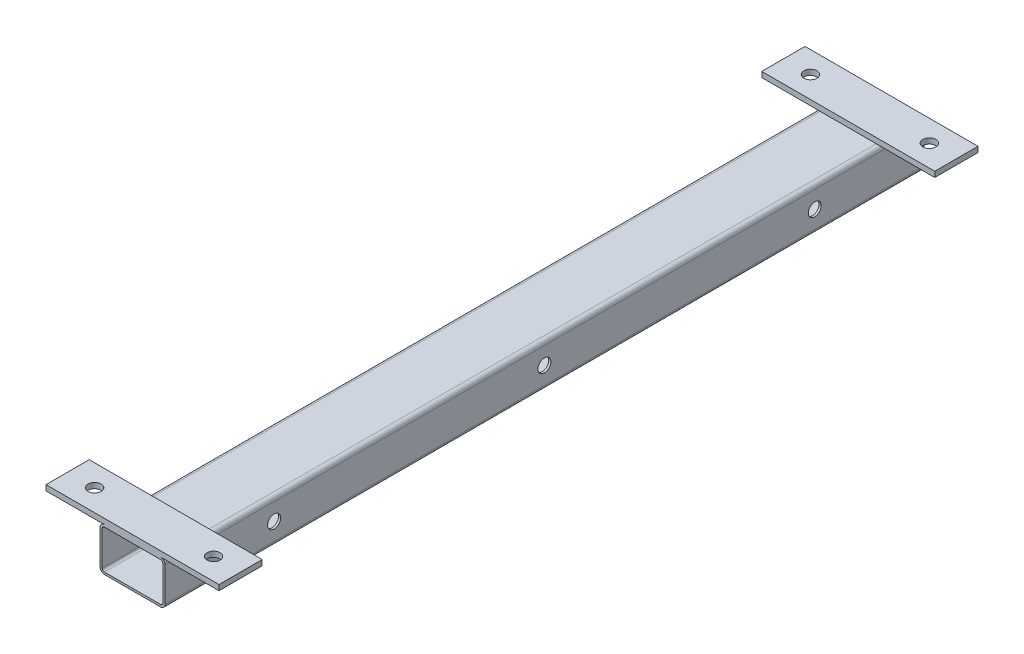
ISO-10303-21;
HEADER;
FILE_DESCRIPTION(('STEP AP214'),'2;1');
FILE_NAME('part.step','',(''),(''),'','','');
FILE_SCHEMA(('AUTOMOTIVE_DESIGN { 1 0 10303 214 1 1 1 1 }'));
ENDSEC;
DATA;
#1=APPLICATION_CONTEXT('core data for automotive mechanical design processes');
#2=APPLICATION_PROTOCOL_DEFINITION('international standard','automotive_design',2000,#1);
#3=PRODUCT_CONTEXT('',#1,'mechanical');
#4=PRODUCT('Part','Part','',(#3));
#5=PRODUCT_RELATED_PRODUCT_CATEGORY('part','',(#4));
#6=PRODUCT_DEFINITION_FORMATION('','',#4);
#7=PRODUCT_DEFINITION_CONTEXT('part definition',#1,'design');
#8=PRODUCT_DEFINITION('design','',#6,#7);
#9=PRODUCT_DEFINITION_SHAPE('','',#8);
#10=(LENGTH_UNIT() NAMED_UNIT(*) SI_UNIT(.MILLI.,.METRE.));
#11=(NAMED_UNIT(*) PLANE_ANGLE_UNIT() SI_UNIT($,.RADIAN.));
#12=(NAMED_UNIT(*) SI_UNIT($,.STERADIAN.) SOLID_ANGLE_UNIT());
#13=UNCERTAINTY_MEASURE_WITH_UNIT(LENGTH_MEASURE(1.E-05),#10,'distance_accuracy_value','');
#14=(GEOMETRIC_REPRESENTATION_CONTEXT(3) GLOBAL_UNCERTAINTY_ASSIGNED_CONTEXT((#13)) GLOBAL_UNIT_ASSIGNED_CONTEXT((#10,
#11,#12)) REPRESENTATION_CONTEXT('',''));
#15=CARTESIAN_POINT('',(0.,0.,0.));
#16=DIRECTION('',(0.,0.,1.));
#17=DIRECTION('',(1.,0.,0.));
#18=AXIS2_PLACEMENT_3D('',#15,#16,#17);
#19=CARTESIAN_POINT('',(4.00000000000003,40.,702.));
#20=DIRECTION('',(0.,-1.,0.));
#21=DIRECTION('',(0.,0.,-1.));
#22=AXIS2_PLACEMENT_3D('',#19,#20,#21);
#23=PLANE('',#22);
#24=DIRECTION('',(0.,0.,-1.));
#25=VECTOR('',#24,1.);
#26=CARTESIAN_POINT('',(4.00000000000003,40.,702.));
#27=LINE('',#26,#25);
#28=CARTESIAN_POINT('',(4.00000000000003,40.,662.));
#29=VERTEX_POINT('',#28);
#30=CARTESIAN_POINT('',(4.,40.,40.));
#31=VERTEX_POINT('',#30);
#32=EDGE_CURVE('E413',#29,#31,#27,.T.);
#33=ORIENTED_EDGE('',*,*,#32,.F.);
#34=DIRECTION('',(1.,0.,0.));
#35=VECTOR('',#34,1.);
#36=CARTESIAN_POINT('',(-50.,40.,662.));
#37=LINE('',#36,#35);
#38=CARTESIAN_POINT('',(56.,40.,662.));
#39=VERTEX_POINT('',#38);
#40=EDGE_CURVE('E254',#29,#39,#37,.T.);
#41=ORIENTED_EDGE('',*,*,#40,.T.);
#42=DIRECTION('',(0.,0.,-1.));
#43=VECTOR('',#42,1.);
#44=CARTESIAN_POINT('',(56.,40.,702.));
#45=LINE('',#44,#43);
#46=CARTESIAN_POINT('',(56.,40.,40.));
#47=VERTEX_POINT('',#46);
#48=EDGE_CURVE('E412',#39,#47,#45,.T.);
#49=ORIENTED_EDGE('',*,*,#48,.T.);
#50=DIRECTION('',(1.,0.,0.));
#51=VECTOR('',#50,1.);
#52=CARTESIAN_POINT('',(-50.,40.,40.));
#53=LINE('',#52,#51);
#54=EDGE_CURVE('E293',#31,#47,#53,.T.);
#55=ORIENTED_EDGE('',*,*,#54,.F.);
#56=EDGE_LOOP('',(#33,#41,#49,#55));
#57=FACE_BOUND('',#56,.T.);
#58=ADVANCED_FACE('F37',(#57),#23,.F.);
#59=CARTESIAN_POINT('',(56.,4.,702.));
#60=DIRECTION('',(0.,0.,-1.));
#61=DIRECTION('',(-1.,0.,0.));
#62=AXIS2_PLACEMENT_3D('',#59,#60,#61);
#63=PLANE('',#62);
#64=CARTESIAN_POINT('',(56.,4.,702.));
#65=DIRECTION('',(0.,0.,1.));
#66=DIRECTION('',(-1.,0.,0.));
#67=AXIS2_PLACEMENT_3D('',#64,#65,#66);
#68=CIRCLE('',#67,4.);
#69=CARTESIAN_POINT('',(56.,0.,702.));
#70=VERTEX_POINT('',#69);
#71=CARTESIAN_POINT('',(60.,4.00000000000003,702.));
#72=VERTEX_POINT('',#71);
#73=EDGE_CURVE('E367',#70,#72,#68,.T.);
#74=ORIENTED_EDGE('',*,*,#73,.T.);
#75=DIRECTION('',(0.,1.,0.));
#76=VECTOR('',#75,1.);
#77=CARTESIAN_POINT('',(60.,36.,702.));
#78=LINE('',#77,#76);
#79=CARTESIAN_POINT('',(60.,36.,702.));
#80=VERTEX_POINT('',#79);
#81=EDGE_CURVE('E369',#72,#80,#78,.T.);
#82=ORIENTED_EDGE('',*,*,#81,.T.);
#83=CARTESIAN_POINT('',(56.,36.,702.));
#84=DIRECTION('',(0.,0.,1.));
#85=DIRECTION('',(1.,0.,0.));
#86=AXIS2_PLACEMENT_3D('',#83,#84,#85);
#87=CIRCLE('',#86,4.);
#88=CARTESIAN_POINT('',(56.,40.,702.));
#89=VERTEX_POINT('',#88);
#90=EDGE_CURVE('E372',#80,#89,#87,.T.);
#91=ORIENTED_EDGE('',*,*,#90,.T.);
#92=DIRECTION('',(-1.,0.,0.));
#93=VECTOR('',#92,1.);
#94=CARTESIAN_POINT('',(0.,40.,702.));
#95=LINE('',#94,#93);
#96=CARTESIAN_POINT('',(110.,40.,702.));
#97=VERTEX_POINT('',#96);
#98=EDGE_CURVE('E221',#97,#89,#95,.T.);
#99=ORIENTED_EDGE('',*,*,#98,.F.);
#100=DIRECTION('',(0.,-1.,0.));
#101=VECTOR('',#100,1.);
#102=CARTESIAN_POINT('',(110.,45.,702.));
#103=LINE('',#102,#101);
#104=CARTESIAN_POINT('',(110.,45.,702.));
#105=VERTEX_POINT('',#104);
#106=EDGE_CURVE('E212',#105,#97,#103,.T.);
#107=ORIENTED_EDGE('',*,*,#106,.F.);
#108=DIRECTION('',(-1.,0.,0.));
#109=VECTOR('',#108,1.);
#110=CARTESIAN_POINT('',(110.,45.,702.));
#111=LINE('',#110,#109);
#112=CARTESIAN_POINT('',(-50.,45.,702.));
#113=VERTEX_POINT('',#112);
#114=EDGE_CURVE('E218',#105,#113,#111,.T.);
#115=ORIENTED_EDGE('',*,*,#114,.T.);
#116=DIRECTION('',(0.,-1.,0.));
#117=VECTOR('',#116,1.);
#118=CARTESIAN_POINT('',(-50.,45.,702.));
#119=LINE('',#118,#117);
#120=CARTESIAN_POINT('',(-50.,40.,702.));
#121=VERTEX_POINT('',#120);
#122=EDGE_CURVE('E247',#113,#121,#119,.T.);
#123=ORIENTED_EDGE('',*,*,#122,.T.);
#124=CARTESIAN_POINT('',(4.,40.,702.));
#125=VERTEX_POINT('',#124);
#126=EDGE_CURVE('E256',#125,#121,#95,.T.);
#127=ORIENTED_EDGE('',*,*,#126,.F.);
#128=CARTESIAN_POINT('',(4.,36.,702.));
#129=DIRECTION('',(0.,0.,1.));
#130=DIRECTION('',(-1.,0.,0.));
#131=AXIS2_PLACEMENT_3D('',#128,#129,#130);
#132=CIRCLE('',#131,4.);
#133=CARTESIAN_POINT('',(0.,36.,702.));
#134=VERTEX_POINT('',#133);
#135=EDGE_CURVE('E374',#125,#134,#132,.T.);
#136=ORIENTED_EDGE('',*,*,#135,.T.);
#137=DIRECTION('',(0.,-1.,0.));
#138=VECTOR('',#137,1.);
#139=CARTESIAN_POINT('',(0.,4.00000000000003,702.));
#140=LINE('',#139,#138);
#141=CARTESIAN_POINT('',(0.,4.00000000000003,702.));
#142=VERTEX_POINT('',#141);
#143=EDGE_CURVE('E376',#134,#142,#140,.T.);
#144=ORIENTED_EDGE('',*,*,#143,.T.);
#145=CARTESIAN_POINT('',(4.,4.,702.));
#146=DIRECTION('',(0.,0.,1.));
#147=DIRECTION('',(1.,0.,0.));
#148=AXIS2_PLACEMENT_3D('',#145,#146,#147);
#149=CIRCLE('',#148,4.);
#150=CARTESIAN_POINT('',(4.00000000000003,0.,702.));
#151=VERTEX_POINT('',#150);
#152=EDGE_CURVE('E378',#142,#151,#149,.T.);
#153=ORIENTED_EDGE('',*,*,#152,.T.);
#154=DIRECTION('',(1.,0.,0.));
#155=VECTOR('',#154,1.);
#156=CARTESIAN_POINT('',(56.,0.,702.));
#157=LINE('',#156,#155);
#158=EDGE_CURVE('E380',#151,#70,#157,.T.);
#159=ORIENTED_EDGE('',*,*,#158,.T.);
#160=EDGE_LOOP('',(#74,#82,#91,#99,#107,#115,#123,#127,#136,#144,#153,#159));
#161=FACE_BOUND('',#160,.T.);
#162=CARTESIAN_POINT('',(4.,4.,702.));
#163=DIRECTION('',(0.,0.,1.));
#164=DIRECTION('',(1.,0.,0.));
#165=AXIS2_PLACEMENT_3D('',#162,#163,#164);
#166=CIRCLE('',#165,2.);
#167=CARTESIAN_POINT('',(2.,4.00000000000003,702.));
#168=VERTEX_POINT('',#167);
#169=CARTESIAN_POINT('',(4.00000000000003,2.,702.));
#170=VERTEX_POINT('',#169);
#171=EDGE_CURVE('E310',#168,#170,#166,.T.);
#172=ORIENTED_EDGE('',*,*,#171,.F.);
#173=DIRECTION('',(0.,-1.,0.));
#174=VECTOR('',#173,1.);
#175=CARTESIAN_POINT('',(2.,4.00000000000003,702.));
#176=LINE('',#175,#174);
#177=CARTESIAN_POINT('',(2.,36.,702.));
#178=VERTEX_POINT('',#177);
#179=EDGE_CURVE('E325',#178,#168,#176,.T.);
#180=ORIENTED_EDGE('',*,*,#179,.F.);
#181=CARTESIAN_POINT('',(4.,36.,702.));
#182=DIRECTION('',(0.,0.,1.));
#183=DIRECTION('',(-1.,0.,0.));
#184=AXIS2_PLACEMENT_3D('',#181,#182,#183);
#185=CIRCLE('',#184,2.);
#186=CARTESIAN_POINT('',(4.00000000000001,38.,702.));
#187=VERTEX_POINT('',#186);
#188=EDGE_CURVE('E323',#187,#178,#185,.T.);
#189=ORIENTED_EDGE('',*,*,#188,.F.);
#190=DIRECTION('',(-1.,0.,0.));
#191=VECTOR('',#190,1.);
#192=CARTESIAN_POINT('',(4.00000000000001,38.,702.));
#193=LINE('',#192,#191);
#194=CARTESIAN_POINT('',(56.,38.,702.));
#195=VERTEX_POINT('',#194);
#196=EDGE_CURVE('E321',#195,#187,#193,.T.);
#197=ORIENTED_EDGE('',*,*,#196,.F.);
#198=CARTESIAN_POINT('',(56.,36.,702.));
#199=DIRECTION('',(0.,0.,1.));
#200=DIRECTION('',(1.,0.,0.));
#201=AXIS2_PLACEMENT_3D('',#198,#199,#200);
#202=CIRCLE('',#201,1.99999999999999);
#203=CARTESIAN_POINT('',(58.,36.,702.));
#204=VERTEX_POINT('',#203);
#205=EDGE_CURVE('E319',#204,#195,#202,.T.);
#206=ORIENTED_EDGE('',*,*,#205,.F.);
#207=DIRECTION('',(0.,1.,0.));
#208=VECTOR('',#207,1.);
#209=CARTESIAN_POINT('',(58.,36.,702.));
#210=LINE('',#209,#208);
#211=CARTESIAN_POINT('',(58.,4.00000000000003,702.));
#212=VERTEX_POINT('',#211);
#213=EDGE_CURVE('E317',#212,#204,#210,.T.);
#214=ORIENTED_EDGE('',*,*,#213,.F.);
#215=CARTESIAN_POINT('',(56.,4.,702.));
#216=DIRECTION('',(0.,0.,1.));
#217=DIRECTION('',(-1.,0.,0.));
#218=AXIS2_PLACEMENT_3D('',#215,#216,#217);
#219=CIRCLE('',#218,2.);
#220=CARTESIAN_POINT('',(56.,2.,702.));
#221=VERTEX_POINT('',#220);
#222=EDGE_CURVE('E315',#221,#212,#219,.T.);
#223=ORIENTED_EDGE('',*,*,#222,.F.);
#224=DIRECTION('',(1.,0.,0.));
#225=VECTOR('',#224,1.);
#226=CARTESIAN_POINT('',(56.,2.,702.));
#227=LINE('',#226,#225);
#228=EDGE_CURVE('E312',#170,#221,#227,.T.);
#229=ORIENTED_EDGE('',*,*,#228,.F.);
#230=EDGE_LOOP('',(#172,#180,#189,#197,#206,#214,#223,#229));
#231=FACE_BOUND('',#230,.T.);
#232=ADVANCED_FACE('F215',(#161,#231),#63,.F.);
#233=CARTESIAN_POINT('',(56.,4.,0.));
#234=DIRECTION('',(0.,0.,-1.));
#235=DIRECTION('',(-1.,0.,0.));
#236=AXIS2_PLACEMENT_3D('',#233,#234,#235);
#237=PLANE('',#236);
#238=CARTESIAN_POINT('',(56.,4.,0.));
#239=DIRECTION('',(0.,0.,1.));
#240=DIRECTION('',(-1.,0.,0.));
#241=AXIS2_PLACEMENT_3D('',#238,#239,#240);
#242=CIRCLE('',#241,4.);
#243=CARTESIAN_POINT('',(56.,0.,0.));
#244=VERTEX_POINT('',#243);
#245=CARTESIAN_POINT('',(60.,4.00000000000003,0.));
#246=VERTEX_POINT('',#245);
#247=EDGE_CURVE('E366',#244,#246,#242,.T.);
#248=ORIENTED_EDGE('',*,*,#247,.F.);
#249=DIRECTION('',(1.,0.,0.));
#250=VECTOR('',#249,1.);
#251=CARTESIAN_POINT('',(56.,0.,0.));
#252=LINE('',#251,#250);
#253=CARTESIAN_POINT('',(4.00000000000003,0.,0.));
#254=VERTEX_POINT('',#253);
#255=EDGE_CURVE('E370',#254,#244,#252,.T.);
#256=ORIENTED_EDGE('',*,*,#255,.F.);
#257=CARTESIAN_POINT('',(4.,4.,0.));
#258=DIRECTION('',(0.,0.,1.));
#259=DIRECTION('',(1.,0.,0.));
#260=AXIS2_PLACEMENT_3D('',#257,#258,#259);
#261=CIRCLE('',#260,4.);
#262=CARTESIAN_POINT('',(0.,4.00000000000003,0.));
#263=VERTEX_POINT('',#262);
#264=EDGE_CURVE('E394',#263,#254,#261,.T.);
#265=ORIENTED_EDGE('',*,*,#264,.F.);
#266=DIRECTION('',(0.,-1.,0.));
#267=VECTOR('',#266,1.);
#268=CARTESIAN_POINT('',(0.,4.00000000000003,0.));
#269=LINE('',#268,#267);
#270=CARTESIAN_POINT('',(0.,36.,0.));
#271=VERTEX_POINT('',#270);
#272=EDGE_CURVE('E392',#271,#263,#269,.T.);
#273=ORIENTED_EDGE('',*,*,#272,.F.);
#274=CARTESIAN_POINT('',(4.,36.,0.));
#275=DIRECTION('',(0.,0.,1.));
#276=DIRECTION('',(-1.,0.,0.));
#277=AXIS2_PLACEMENT_3D('',#274,#275,#276);
#278=CIRCLE('',#277,4.);
#279=CARTESIAN_POINT('',(4.00000000000003,40.,0.));
#280=VERTEX_POINT('',#279);
#281=EDGE_CURVE('E390',#280,#271,#278,.T.);
#282=ORIENTED_EDGE('',*,*,#281,.F.);
#283=DIRECTION('',(-1.,0.,0.));
#284=VECTOR('',#283,1.);
#285=CARTESIAN_POINT('',(0.,40.,0.));
#286=LINE('',#285,#284);
#287=CARTESIAN_POINT('',(-50.,40.,0.));
#288=VERTEX_POINT('',#287);
#289=EDGE_CURVE('E271',#280,#288,#286,.T.);
#290=ORIENTED_EDGE('',*,*,#289,.T.);
#291=DIRECTION('',(0.,-1.,0.));
#292=VECTOR('',#291,1.);
#293=CARTESIAN_POINT('',(-50.,45.,0.));
#294=LINE('',#293,#292);
#295=CARTESIAN_POINT('',(-50.,45.,0.));
#296=VERTEX_POINT('',#295);
#297=EDGE_CURVE('E304',#296,#288,#294,.T.);
#298=ORIENTED_EDGE('',*,*,#297,.F.);
#299=DIRECTION('',(-1.,0.,0.));
#300=VECTOR('',#299,1.);
#301=CARTESIAN_POINT('',(110.,45.,0.));
#302=LINE('',#301,#300);
#303=CARTESIAN_POINT('',(110.,45.,0.));
#304=VERTEX_POINT('',#303);
#305=EDGE_CURVE('E274',#304,#296,#302,.T.);
#306=ORIENTED_EDGE('',*,*,#305,.F.);
#307=DIRECTION('',(0.,-1.,0.));
#308=VECTOR('',#307,1.);
#309=CARTESIAN_POINT('',(110.,45.,0.));
#310=LINE('',#309,#308);
#311=CARTESIAN_POINT('',(110.,40.,0.));
#312=VERTEX_POINT('',#311);
#313=EDGE_CURVE('E283',#304,#312,#310,.T.);
#314=ORIENTED_EDGE('',*,*,#313,.T.);
#315=CARTESIAN_POINT('',(56.,40.,0.));
#316=VERTEX_POINT('',#315);
#317=EDGE_CURVE('E284',#312,#316,#286,.T.);
#318=ORIENTED_EDGE('',*,*,#317,.T.);
#319=CARTESIAN_POINT('',(56.,36.,0.));
#320=DIRECTION('',(0.,0.,1.));
#321=DIRECTION('',(1.,0.,0.));
#322=AXIS2_PLACEMENT_3D('',#319,#320,#321);
#323=CIRCLE('',#322,4.);
#324=CARTESIAN_POINT('',(60.,36.,0.));
#325=VERTEX_POINT('',#324);
#326=EDGE_CURVE('E387',#325,#316,#323,.T.);
#327=ORIENTED_EDGE('',*,*,#326,.F.);
#328=DIRECTION('',(0.,1.,0.));
#329=VECTOR('',#328,1.);
#330=CARTESIAN_POINT('',(60.,36.,0.));
#331=LINE('',#330,#329);
#332=EDGE_CURVE('E385',#246,#325,#331,.T.);
#333=ORIENTED_EDGE('',*,*,#332,.F.);
#334=EDGE_LOOP('',(#248,#256,#265,#273,#282,#290,#298,#306,#314,#318,#327,#333));
#335=FACE_BOUND('',#334,.T.);
#336=DIRECTION('',(0.,-1.,0.));
#337=VECTOR('',#336,1.);
#338=CARTESIAN_POINT('',(2.,4.00000000000003,0.));
#339=LINE('',#338,#337);
#340=CARTESIAN_POINT('',(2.,36.,0.));
#341=VERTEX_POINT('',#340);
#342=CARTESIAN_POINT('',(2.,4.00000000000003,0.));
#343=VERTEX_POINT('',#342);
#344=EDGE_CURVE('E313',#341,#343,#339,.T.);
#345=ORIENTED_EDGE('',*,*,#344,.T.);
#346=CARTESIAN_POINT('',(4.,4.,0.));
#347=DIRECTION('',(0.,0.,1.));
#348=DIRECTION('',(1.,0.,0.));
#349=AXIS2_PLACEMENT_3D('',#346,#347,#348);
#350=CIRCLE('',#349,2.);
#351=CARTESIAN_POINT('',(4.00000000000003,2.,0.));
#352=VERTEX_POINT('',#351);
#353=EDGE_CURVE('E309',#343,#352,#350,.T.);
#354=ORIENTED_EDGE('',*,*,#353,.T.);
#355=DIRECTION('',(1.,0.,0.));
#356=VECTOR('',#355,1.);
#357=CARTESIAN_POINT('',(56.,2.,0.));
#358=LINE('',#357,#356);
#359=CARTESIAN_POINT('',(56.,2.,0.));
#360=VERTEX_POINT('',#359);
#361=EDGE_CURVE('E330',#352,#360,#358,.T.);
#362=ORIENTED_EDGE('',*,*,#361,.T.);
#363=CARTESIAN_POINT('',(56.,4.,0.));
#364=DIRECTION('',(0.,0.,1.));
#365=DIRECTION('',(-1.,0.,0.));
#366=AXIS2_PLACEMENT_3D('',#363,#364,#365);
#367=CIRCLE('',#366,2.);
#368=CARTESIAN_POINT('',(58.,4.00000000000003,0.));
#369=VERTEX_POINT('',#368);
#370=EDGE_CURVE('E333',#360,#369,#367,.T.);
#371=ORIENTED_EDGE('',*,*,#370,.T.);
#372=DIRECTION('',(0.,1.,0.));
#373=VECTOR('',#372,1.);
#374=CARTESIAN_POINT('',(58.,36.,0.));
#375=LINE('',#374,#373);
#376=CARTESIAN_POINT('',(58.,36.,0.));
#377=VERTEX_POINT('',#376);
#378=EDGE_CURVE('E336',#369,#377,#375,.T.);
#379=ORIENTED_EDGE('',*,*,#378,.T.);
#380=CARTESIAN_POINT('',(56.,36.,0.));
#381=DIRECTION('',(0.,0.,1.));
#382=DIRECTION('',(1.,0.,0.));
#383=AXIS2_PLACEMENT_3D('',#380,#381,#382);
#384=CIRCLE('',#383,1.99999999999999);
#385=CARTESIAN_POINT('',(56.,38.,0.));
#386=VERTEX_POINT('',#385);
#387=EDGE_CURVE('E339',#377,#386,#384,.T.);
#388=ORIENTED_EDGE('',*,*,#387,.T.);
#389=DIRECTION('',(-1.,0.,0.));
#390=VECTOR('',#389,1.);
#391=CARTESIAN_POINT('',(4.00000000000001,38.,0.));
#392=LINE('',#391,#390);
#393=CARTESIAN_POINT('',(4.00000000000001,38.,0.));
#394=VERTEX_POINT('',#393);
#395=EDGE_CURVE('E342',#386,#394,#392,.T.);
#396=ORIENTED_EDGE('',*,*,#395,.T.);
#397=CARTESIAN_POINT('',(4.,36.,0.));
#398=DIRECTION('',(0.,0.,1.));
#399=DIRECTION('',(-1.,0.,0.));
#400=AXIS2_PLACEMENT_3D('',#397,#398,#399);
#401=CIRCLE('',#400,2.);
#402=EDGE_CURVE('E345',#394,#341,#401,.T.);
#403=ORIENTED_EDGE('',*,*,#402,.T.);
#404=EDGE_LOOP('',(#345,#354,#362,#371,#379,#388,#396,#403));
#405=FACE_BOUND('',#404,.T.);
#406=ADVANCED_FACE('F484',(#335,#405),#237,.T.);
#407=CARTESIAN_POINT('',(56.,4.,702.));
#408=DIRECTION('',(0.,0.,-1.));
#409=DIRECTION('',(-1.,0.,0.));
#410=AXIS2_PLACEMENT_3D('',#407,#408,#409);
#411=CYLINDRICAL_SURFACE('',#410,4.);
#412=ORIENTED_EDGE('',*,*,#247,.T.);
#413=DIRECTION('',(0.,0.,-1.));
#414=VECTOR('',#413,1.);
#415=CARTESIAN_POINT('',(60.,4.00000000000003,702.));
#416=LINE('',#415,#414);
#417=EDGE_CURVE('E11',#72,#246,#416,.T.);
#418=ORIENTED_EDGE('',*,*,#417,.F.);
#419=ORIENTED_EDGE('',*,*,#73,.F.);
#420=DIRECTION('',(0.,0.,-1.));
#421=VECTOR('',#420,1.);
#422=CARTESIAN_POINT('',(56.,0.,702.));
#423=LINE('',#422,#421);
#424=EDGE_CURVE('E382',#70,#244,#423,.T.);
#425=ORIENTED_EDGE('',*,*,#424,.T.);
#426=EDGE_LOOP('',(#412,#418,#419,#425));
#427=FACE_BOUND('',#426,.T.);
#428=ADVANCED_FACE('F39',(#427),#411,.T.);
#429=CARTESIAN_POINT('',(60.,36.,702.));
#430=DIRECTION('',(-1.,0.,0.));
#431=DIRECTION('',(0.,0.,1.));
#432=AXIS2_PLACEMENT_3D('',#429,#430,#431);
#433=PLANE('',#432);
#434=CARTESIAN_POINT('',(60.,20.,101.));
#435=DIRECTION('',(1.,0.,0.));
#436=DIRECTION('',(0.,0.,-1.));
#437=AXIS2_PLACEMENT_3D('',#434,#435,#436);
#438=CIRCLE('',#437,6.);
#439=CARTESIAN_POINT('',(60.,20.,95.));
#440=VERTEX_POINT('',#439);
#441=EDGE_CURVE('E421',#440,#440,#438,.T.);
#442=ORIENTED_EDGE('',*,*,#441,.F.);
#443=EDGE_LOOP('',(#442));
#444=FACE_BOUND('',#443,.T.);
#445=CARTESIAN_POINT('',(60.,20.,351.));
#446=DIRECTION('',(1.,0.,0.));
#447=DIRECTION('',(0.,0.,-1.));
#448=AXIS2_PLACEMENT_3D('',#445,#446,#447);
#449=CIRCLE('',#448,5.99999999999999);
#450=CARTESIAN_POINT('',(60.,20.,345.));
#451=VERTEX_POINT('',#450);
#452=EDGE_CURVE('E507',#451,#451,#449,.T.);
#453=ORIENTED_EDGE('',*,*,#452,.F.);
#454=EDGE_LOOP('',(#453));
#455=FACE_BOUND('',#454,.T.);
#456=CARTESIAN_POINT('',(60.,20.,601.));
#457=DIRECTION('',(1.,0.,0.));
#458=DIRECTION('',(0.,0.,-1.));
#459=AXIS2_PLACEMENT_3D('',#456,#457,#458);
#460=CIRCLE('',#459,5.99999999999999);
#461=CARTESIAN_POINT('',(60.,20.,595.));
#462=VERTEX_POINT('',#461);
#463=EDGE_CURVE('E511',#462,#462,#460,.T.);
#464=ORIENTED_EDGE('',*,*,#463,.F.);
#465=EDGE_LOOP('',(#464));
#466=FACE_BOUND('',#465,.T.);
#467=ORIENTED_EDGE('',*,*,#332,.T.);
#468=DIRECTION('',(0.,0.,-1.));
#469=VECTOR('',#468,1.);
#470=CARTESIAN_POINT('',(60.,36.,702.));
#471=LINE('',#470,#469);
#472=EDGE_CURVE('E46',#80,#325,#471,.T.);
#473=ORIENTED_EDGE('',*,*,#472,.F.);
#474=ORIENTED_EDGE('',*,*,#81,.F.);
#475=ORIENTED_EDGE('',*,*,#417,.T.);
#476=EDGE_LOOP('',(#467,#473,#474,#475));
#477=FACE_BOUND('',#476,.T.);
#478=ADVANCED_FACE('F493',(#444,#455,#466,#477),#433,.F.);
#479=CARTESIAN_POINT('',(56.,36.,702.));
#480=DIRECTION('',(0.,0.,-1.));
#481=DIRECTION('',(-1.,0.,0.));
#482=AXIS2_PLACEMENT_3D('',#479,#480,#481);
#483=CYLINDRICAL_SURFACE('',#482,4.);
#484=ORIENTED_EDGE('',*,*,#326,.T.);
#485=DIRECTION('',(0.,0.,-1.));
#486=VECTOR('',#485,1.);
#487=CARTESIAN_POINT('',(56.,40.,702.));
#488=LINE('',#487,#486);
#489=EDGE_CURVE('E307',#47,#316,#488,.T.);
#490=ORIENTED_EDGE('',*,*,#489,.F.);
#491=ORIENTED_EDGE('',*,*,#48,.F.);
#492=EDGE_CURVE('E414',#89,#39,#45,.T.);
#493=ORIENTED_EDGE('',*,*,#492,.F.);
#494=ORIENTED_EDGE('',*,*,#90,.F.);
#495=ORIENTED_EDGE('',*,*,#472,.T.);
#496=EDGE_LOOP('',(#484,#490,#491,#493,#494,#495));
#497=FACE_BOUND('',#496,.T.);
#498=ADVANCED_FACE('F491',(#497),#483,.T.);
#499=CARTESIAN_POINT('',(4.,36.,702.));
#500=DIRECTION('',(0.,0.,-1.));
#501=DIRECTION('',(-1.,0.,0.));
#502=AXIS2_PLACEMENT_3D('',#499,#500,#501);
#503=CYLINDRICAL_SURFACE('',#502,4.);
#504=ORIENTED_EDGE('',*,*,#281,.T.);
#505=DIRECTION('',(0.,0.,-1.));
#506=VECTOR('',#505,1.);
#507=CARTESIAN_POINT('',(0.,36.,702.));
#508=LINE('',#507,#506);
#509=EDGE_CURVE('E405',#134,#271,#508,.T.);
#510=ORIENTED_EDGE('',*,*,#509,.F.);
#511=ORIENTED_EDGE('',*,*,#135,.F.);
#512=EDGE_CURVE('E409',#125,#29,#27,.T.);
#513=ORIENTED_EDGE('',*,*,#512,.T.);
#514=ORIENTED_EDGE('',*,*,#32,.T.);
#515=EDGE_CURVE('E408',#31,#280,#27,.T.);
#516=ORIENTED_EDGE('',*,*,#515,.T.);
#517=EDGE_LOOP('',(#504,#510,#511,#513,#514,#516));
#518=FACE_BOUND('',#517,.T.);
#519=ADVANCED_FACE('F489',(#518),#503,.T.);
#520=CARTESIAN_POINT('',(0.,4.00000000000003,702.));
#521=DIRECTION('',(1.,0.,0.));
#522=DIRECTION('',(0.,0.,-1.));
#523=AXIS2_PLACEMENT_3D('',#520,#521,#522);
#524=PLANE('',#523);
#525=CARTESIAN_POINT('',(0.,20.,101.));
#526=DIRECTION('',(1.,0.,0.));
#527=DIRECTION('',(0.,0.,-1.));
#528=AXIS2_PLACEMENT_3D('',#525,#526,#527);
#529=CIRCLE('',#528,6.);
#530=CARTESIAN_POINT('',(0.,20.,95.));
#531=VERTEX_POINT('',#530);
#532=EDGE_CURVE('E444',#531,#531,#529,.T.);
#533=ORIENTED_EDGE('',*,*,#532,.T.);
#534=EDGE_LOOP('',(#533));
#535=FACE_BOUND('',#534,.T.);
#536=CARTESIAN_POINT('',(0.,20.,351.));
#537=DIRECTION('',(1.,0.,0.));
#538=DIRECTION('',(0.,0.,-1.));
#539=AXIS2_PLACEMENT_3D('',#536,#537,#538);
#540=CIRCLE('',#539,5.99999999999999);
#541=CARTESIAN_POINT('',(0.,20.,345.));
#542=VERTEX_POINT('',#541);
#543=EDGE_CURVE('E429',#542,#542,#540,.T.);
#544=ORIENTED_EDGE('',*,*,#543,.T.);
#545=EDGE_LOOP('',(#544));
#546=FACE_BOUND('',#545,.T.);
#547=CARTESIAN_POINT('',(0.,20.,601.));
#548=DIRECTION('',(1.,0.,0.));
#549=DIRECTION('',(0.,0.,-1.));
#550=AXIS2_PLACEMENT_3D('',#547,#548,#549);
#551=CIRCLE('',#550,5.99999999999999);
#552=CARTESIAN_POINT('',(0.,20.,595.));
#553=VERTEX_POINT('',#552);
#554=EDGE_CURVE('E425',#553,#553,#551,.T.);
#555=ORIENTED_EDGE('',*,*,#554,.T.);
#556=EDGE_LOOP('',(#555));
#557=FACE_BOUND('',#556,.T.);
#558=ORIENTED_EDGE('',*,*,#272,.T.);
#559=DIRECTION('',(0.,0.,-1.));
#560=VECTOR('',#559,1.);
#561=CARTESIAN_POINT('',(0.,4.00000000000003,702.));
#562=LINE('',#561,#560);
#563=EDGE_CURVE('E402',#142,#263,#562,.T.);
#564=ORIENTED_EDGE('',*,*,#563,.F.);
#565=ORIENTED_EDGE('',*,*,#143,.F.);
#566=ORIENTED_EDGE('',*,*,#509,.T.);
#567=EDGE_LOOP('',(#558,#564,#565,#566));
#568=FACE_BOUND('',#567,.T.);
#569=ADVANCED_FACE('F555',(#535,#546,#557,#568),#524,.F.);
#570=CARTESIAN_POINT('',(4.,4.,702.));
#571=DIRECTION('',(0.,0.,-1.));
#572=DIRECTION('',(-1.,0.,0.));
#573=AXIS2_PLACEMENT_3D('',#570,#571,#572);
#574=CYLINDRICAL_SURFACE('',#573,4.);
#575=ORIENTED_EDGE('',*,*,#264,.T.);
#576=DIRECTION('',(0.,0.,-1.));
#577=VECTOR('',#576,1.);
#578=CARTESIAN_POINT('',(4.00000000000003,0.,702.));
#579=LINE('',#578,#577);
#580=EDGE_CURVE('E399',#151,#254,#579,.T.);
#581=ORIENTED_EDGE('',*,*,#580,.F.);
#582=ORIENTED_EDGE('',*,*,#152,.F.);
#583=ORIENTED_EDGE('',*,*,#563,.T.);
#584=EDGE_LOOP('',(#575,#581,#582,#583));
#585=FACE_BOUND('',#584,.T.);
#586=ADVANCED_FACE('F561',(#585),#574,.T.);
#587=CARTESIAN_POINT('',(56.,0.,702.));
#588=DIRECTION('',(0.,1.,0.));
#589=DIRECTION('',(0.,0.,1.));
#590=AXIS2_PLACEMENT_3D('',#587,#588,#589);
#591=PLANE('',#590);
#592=ORIENTED_EDGE('',*,*,#255,.T.);
#593=ORIENTED_EDGE('',*,*,#424,.F.);
#594=ORIENTED_EDGE('',*,*,#158,.F.);
#595=ORIENTED_EDGE('',*,*,#580,.T.);
#596=EDGE_LOOP('',(#592,#593,#594,#595));
#597=FACE_BOUND('',#596,.T.);
#598=ADVANCED_FACE('F565',(#597),#591,.F.);
#599=CARTESIAN_POINT('',(4.,4.,702.));
#600=DIRECTION('',(0.,0.,-1.));
#601=DIRECTION('',(-1.,0.,0.));
#602=AXIS2_PLACEMENT_3D('',#599,#600,#601);
#603=CYLINDRICAL_SURFACE('',#602,2.);
#604=ORIENTED_EDGE('',*,*,#353,.F.);
#605=DIRECTION('',(0.,0.,-1.));
#606=VECTOR('',#605,1.);
#607=CARTESIAN_POINT('',(2.,4.00000000000003,702.));
#608=LINE('',#607,#606);
#609=EDGE_CURVE('E327',#168,#343,#608,.T.);
#610=ORIENTED_EDGE('',*,*,#609,.F.);
#611=ORIENTED_EDGE('',*,*,#171,.T.);
#612=DIRECTION('',(0.,0.,-1.));
#613=VECTOR('',#612,1.);
#614=CARTESIAN_POINT('',(4.00000000000003,2.,702.));
#615=LINE('',#614,#613);
#616=EDGE_CURVE('E363',#170,#352,#615,.T.);
#617=ORIENTED_EDGE('',*,*,#616,.T.);
#618=EDGE_LOOP('',(#604,#610,#611,#617));
#619=FACE_BOUND('',#618,.T.);
#620=ADVANCED_FACE('F629',(#619),#603,.F.);
#621=CARTESIAN_POINT('',(56.,2.,702.));
#622=DIRECTION('',(0.,1.,0.));
#623=DIRECTION('',(-1.,0.,0.));
#624=AXIS2_PLACEMENT_3D('',#621,#622,#623);
#625=PLANE('',#624);
#626=ORIENTED_EDGE('',*,*,#361,.F.);
#627=ORIENTED_EDGE('',*,*,#616,.F.);
#628=ORIENTED_EDGE('',*,*,#228,.T.);
#629=DIRECTION('',(0.,0.,-1.));
#630=VECTOR('',#629,1.);
#631=CARTESIAN_POINT('',(56.,2.,702.));
#632=LINE('',#631,#630);
#633=EDGE_CURVE('E361',#221,#360,#632,.T.);
#634=ORIENTED_EDGE('',*,*,#633,.T.);
#635=EDGE_LOOP('',(#626,#627,#628,#634));
#636=FACE_BOUND('',#635,.T.);
#637=ADVANCED_FACE('F625',(#636),#625,.T.);
#638=CARTESIAN_POINT('',(56.,4.,702.));
#639=DIRECTION('',(0.,0.,-1.));
#640=DIRECTION('',(-1.,0.,0.));
#641=AXIS2_PLACEMENT_3D('',#638,#639,#640);
#642=CYLINDRICAL_SURFACE('',#641,2.);
#643=ORIENTED_EDGE('',*,*,#370,.F.);
#644=ORIENTED_EDGE('',*,*,#633,.F.);
#645=ORIENTED_EDGE('',*,*,#222,.T.);
#646=DIRECTION('',(0.,0.,-1.));
#647=VECTOR('',#646,1.);
#648=CARTESIAN_POINT('',(58.,4.00000000000003,702.));
#649=LINE('',#648,#647);
#650=EDGE_CURVE('E359',#212,#369,#649,.T.);
#651=ORIENTED_EDGE('',*,*,#650,.T.);
#652=EDGE_LOOP('',(#643,#644,#645,#651));
#653=FACE_BOUND('',#652,.T.);
#654=ADVANCED_FACE('F621',(#653),#642,.F.);
#655=CARTESIAN_POINT('',(58.,36.,702.));
#656=DIRECTION('',(-1.,0.,0.));
#657=DIRECTION('',(0.,0.,1.));
#658=AXIS2_PLACEMENT_3D('',#655,#656,#657);
#659=PLANE('',#658);
#660=CARTESIAN_POINT('',(58.,20.,101.));
#661=DIRECTION('',(-1.,0.,0.));
#662=DIRECTION('',(0.,0.,1.));
#663=AXIS2_PLACEMENT_3D('',#660,#661,#662);
#664=CIRCLE('',#663,6.);
#665=CARTESIAN_POINT('',(58.,20.,107.));
#666=VERTEX_POINT('',#665);
#667=EDGE_CURVE('E441',#666,#666,#664,.T.);
#668=ORIENTED_EDGE('',*,*,#667,.F.);
#669=EDGE_LOOP('',(#668));
#670=FACE_BOUND('',#669,.T.);
#671=CARTESIAN_POINT('',(58.,20.,351.));
#672=DIRECTION('',(-1.,0.,0.));
#673=DIRECTION('',(0.,0.,1.));
#674=AXIS2_PLACEMENT_3D('',#671,#672,#673);
#675=CIRCLE('',#674,5.99999999999999);
#676=CARTESIAN_POINT('',(58.,20.,357.));
#677=VERTEX_POINT('',#676);
#678=EDGE_CURVE('E424',#677,#677,#675,.T.);
#679=ORIENTED_EDGE('',*,*,#678,.F.);
#680=EDGE_LOOP('',(#679));
#681=FACE_BOUND('',#680,.T.);
#682=CARTESIAN_POINT('',(58.,20.,601.));
#683=DIRECTION('',(-1.,0.,0.));
#684=DIRECTION('',(0.,0.,1.));
#685=AXIS2_PLACEMENT_3D('',#682,#683,#684);
#686=CIRCLE('',#685,5.99999999999999);
#687=CARTESIAN_POINT('',(58.,20.,607.));
#688=VERTEX_POINT('',#687);
#689=EDGE_CURVE('E420',#688,#688,#686,.T.);
#690=ORIENTED_EDGE('',*,*,#689,.F.);
#691=EDGE_LOOP('',(#690));
#692=FACE_BOUND('',#691,.T.);
#693=ORIENTED_EDGE('',*,*,#378,.F.);
#694=ORIENTED_EDGE('',*,*,#650,.F.);
#695=ORIENTED_EDGE('',*,*,#213,.T.);
#696=DIRECTION('',(0.,0.,-1.));
#697=VECTOR('',#696,1.);
#698=CARTESIAN_POINT('',(58.,36.,702.));
#699=LINE('',#698,#697);
#700=EDGE_CURVE('E357',#204,#377,#699,.T.);
#701=ORIENTED_EDGE('',*,*,#700,.T.);
#702=EDGE_LOOP('',(#693,#694,#695,#701));
#703=FACE_BOUND('',#702,.T.);
#704=ADVANCED_FACE('F617',(#670,#681,#692,#703),#659,.T.);
#705=CARTESIAN_POINT('',(56.,36.,702.));
#706=DIRECTION('',(0.,0.,-1.));
#707=DIRECTION('',(-1.,0.,0.));
#708=AXIS2_PLACEMENT_3D('',#705,#706,#707);
#709=CYLINDRICAL_SURFACE('',#708,1.99999999999999);
#710=ORIENTED_EDGE('',*,*,#387,.F.);
#711=ORIENTED_EDGE('',*,*,#700,.F.);
#712=ORIENTED_EDGE('',*,*,#205,.T.);
#713=DIRECTION('',(0.,0.,-1.));
#714=VECTOR('',#713,1.);
#715=CARTESIAN_POINT('',(56.,38.,702.));
#716=LINE('',#715,#714);
#717=EDGE_CURVE('E355',#195,#386,#716,.T.);
#718=ORIENTED_EDGE('',*,*,#717,.T.);
#719=EDGE_LOOP('',(#710,#711,#712,#718));
#720=FACE_BOUND('',#719,.T.);
#721=ADVANCED_FACE('F613',(#720),#709,.F.);
#722=CARTESIAN_POINT('',(4.00000000000001,38.,702.));
#723=DIRECTION('',(0.,-1.,0.));
#724=DIRECTION('',(1.,0.,0.));
#725=AXIS2_PLACEMENT_3D('',#722,#723,#724);
#726=PLANE('',#725);
#727=ORIENTED_EDGE('',*,*,#395,.F.);
#728=ORIENTED_EDGE('',*,*,#717,.F.);
#729=ORIENTED_EDGE('',*,*,#196,.T.);
#730=DIRECTION('',(0.,0.,-1.));
#731=VECTOR('',#730,1.);
#732=CARTESIAN_POINT('',(4.00000000000001,38.,702.));
#733=LINE('',#732,#731);
#734=EDGE_CURVE('E353',#187,#394,#733,.T.);
#735=ORIENTED_EDGE('',*,*,#734,.T.);
#736=EDGE_LOOP('',(#727,#728,#729,#735));
#737=FACE_BOUND('',#736,.T.);
#738=ADVANCED_FACE('F609',(#737),#726,.T.);
#739=CARTESIAN_POINT('',(4.,36.,702.));
#740=DIRECTION('',(0.,0.,-1.));
#741=DIRECTION('',(-1.,0.,0.));
#742=AXIS2_PLACEMENT_3D('',#739,#740,#741);
#743=CYLINDRICAL_SURFACE('',#742,2.);
#744=ORIENTED_EDGE('',*,*,#402,.F.);
#745=ORIENTED_EDGE('',*,*,#734,.F.);
#746=ORIENTED_EDGE('',*,*,#188,.T.);
#747=DIRECTION('',(0.,0.,-1.));
#748=VECTOR('',#747,1.);
#749=CARTESIAN_POINT('',(2.,36.,702.));
#750=LINE('',#749,#748);
#751=EDGE_CURVE('E62',#178,#341,#750,.T.);
#752=ORIENTED_EDGE('',*,*,#751,.T.);
#753=EDGE_LOOP('',(#744,#745,#746,#752));
#754=FACE_BOUND('',#753,.T.);
#755=ADVANCED_FACE('F605',(#754),#743,.F.);
#756=CARTESIAN_POINT('',(2.,4.00000000000003,702.));
#757=DIRECTION('',(1.,0.,0.));
#758=DIRECTION('',(0.,0.,-1.));
#759=AXIS2_PLACEMENT_3D('',#756,#757,#758);
#760=PLANE('',#759);
#761=CARTESIAN_POINT('',(2.,20.,101.));
#762=DIRECTION('',(1.,0.,0.));
#763=DIRECTION('',(0.,0.,-1.));
#764=AXIS2_PLACEMENT_3D('',#761,#762,#763);
#765=CIRCLE('',#764,6.);
#766=CARTESIAN_POINT('',(2.,20.,95.));
#767=VERTEX_POINT('',#766);
#768=EDGE_CURVE('E41',#767,#767,#765,.T.);
#769=ORIENTED_EDGE('',*,*,#768,.F.);
#770=EDGE_LOOP('',(#769));
#771=FACE_BOUND('',#770,.T.);
#772=CARTESIAN_POINT('',(2.,20.,351.));
#773=DIRECTION('',(1.,0.,0.));
#774=DIRECTION('',(0.,0.,-1.));
#775=AXIS2_PLACEMENT_3D('',#772,#773,#774);
#776=CIRCLE('',#775,5.99999999999999);
#777=CARTESIAN_POINT('',(2.,20.,345.));
#778=VERTEX_POINT('',#777);
#779=EDGE_CURVE('E422',#778,#778,#776,.T.);
#780=ORIENTED_EDGE('',*,*,#779,.F.);
#781=EDGE_LOOP('',(#780));
#782=FACE_BOUND('',#781,.T.);
#783=CARTESIAN_POINT('',(2.,20.,601.));
#784=DIRECTION('',(1.,0.,0.));
#785=DIRECTION('',(0.,0.,-1.));
#786=AXIS2_PLACEMENT_3D('',#783,#784,#785);
#787=CIRCLE('',#786,5.99999999999999);
#788=CARTESIAN_POINT('',(2.,20.,595.));
#789=VERTEX_POINT('',#788);
#790=EDGE_CURVE('E418',#789,#789,#787,.T.);
#791=ORIENTED_EDGE('',*,*,#790,.F.);
#792=EDGE_LOOP('',(#791));
#793=FACE_BOUND('',#792,.T.);
#794=ORIENTED_EDGE('',*,*,#344,.F.);
#795=ORIENTED_EDGE('',*,*,#751,.F.);
#796=ORIENTED_EDGE('',*,*,#179,.T.);
#797=ORIENTED_EDGE('',*,*,#609,.T.);
#798=EDGE_LOOP('',(#794,#795,#796,#797));
#799=FACE_BOUND('',#798,.T.);
#800=ADVANCED_FACE('F602',(#771,#782,#793,#799),#760,.T.);
#801=CARTESIAN_POINT('',(0.,40.,0.));
#802=DIRECTION('',(0.,1.,0.));
#803=DIRECTION('',(0.,0.,1.));
#804=AXIS2_PLACEMENT_3D('',#801,#802,#803);
#805=PLANE('',#804);
#806=CARTESIAN_POINT('',(85.,40.,20.));
#807=DIRECTION('',(0.,1.,0.));
#808=DIRECTION('',(0.,0.,1.));
#809=AXIS2_PLACEMENT_3D('',#806,#807,#808);
#810=CIRCLE('',#809,6.);
#811=CARTESIAN_POINT('',(85.,40.,26.));
#812=VERTEX_POINT('',#811);
#813=EDGE_CURVE('E226',#812,#812,#810,.T.);
#814=ORIENTED_EDGE('',*,*,#813,.T.);
#815=EDGE_LOOP('',(#814));
#816=FACE_BOUND('',#815,.T.);
#817=CARTESIAN_POINT('',(110.,40.,40.));
#818=VERTEX_POINT('',#817);
#819=EDGE_CURVE('E289',#47,#818,#53,.T.);
#820=ORIENTED_EDGE('',*,*,#819,.F.);
#821=ORIENTED_EDGE('',*,*,#489,.T.);
#822=ORIENTED_EDGE('',*,*,#317,.F.);
#823=DIRECTION('',(0.,0.,-1.));
#824=VECTOR('',#823,1.);
#825=CARTESIAN_POINT('',(110.,40.,40.));
#826=LINE('',#825,#824);
#827=EDGE_CURVE('E277',#818,#312,#826,.T.);
#828=ORIENTED_EDGE('',*,*,#827,.F.);
#829=EDGE_LOOP('',(#820,#821,#822,#828));
#830=FACE_BOUND('',#829,.T.);
#831=ADVANCED_FACE('F526',(#816,#830),#805,.F.);
#832=CARTESIAN_POINT('',(0.,45.,0.));
#833=DIRECTION('',(0.,1.,0.));
#834=DIRECTION('',(0.,0.,1.));
#835=AXIS2_PLACEMENT_3D('',#832,#833,#834);
#836=PLANE('',#835);
#837=CARTESIAN_POINT('',(-25.,45.,20.));
#838=DIRECTION('',(0.,1.,0.));
#839=DIRECTION('',(0.,0.,1.));
#840=AXIS2_PLACEMENT_3D('',#837,#838,#839);
#841=CIRCLE('',#840,6.);
#842=CARTESIAN_POINT('',(-25.,45.,26.));
#843=VERTEX_POINT('',#842);
#844=EDGE_CURVE('E268',#843,#843,#841,.T.);
#845=ORIENTED_EDGE('',*,*,#844,.F.);
#846=EDGE_LOOP('',(#845));
#847=FACE_BOUND('',#846,.T.);
#848=ORIENTED_EDGE('',*,*,#305,.T.);
#849=DIRECTION('',(0.,0.,1.));
#850=VECTOR('',#849,1.);
#851=CARTESIAN_POINT('',(-50.,45.,0.));
#852=LINE('',#851,#850);
#853=CARTESIAN_POINT('',(-50.,45.,40.));
#854=VERTEX_POINT('',#853);
#855=EDGE_CURVE('E276',#296,#854,#852,.T.);
#856=ORIENTED_EDGE('',*,*,#855,.T.);
#857=DIRECTION('',(1.,0.,0.));
#858=VECTOR('',#857,1.);
#859=CARTESIAN_POINT('',(-50.,45.,40.));
#860=LINE('',#859,#858);
#861=CARTESIAN_POINT('',(110.,45.,40.));
#862=VERTEX_POINT('',#861);
#863=EDGE_CURVE('E279',#854,#862,#860,.T.);
#864=ORIENTED_EDGE('',*,*,#863,.T.);
#865=DIRECTION('',(0.,0.,-1.));
#866=VECTOR('',#865,1.);
#867=CARTESIAN_POINT('',(110.,45.,40.));
#868=LINE('',#867,#866);
#869=EDGE_CURVE('E281',#862,#304,#868,.T.);
#870=ORIENTED_EDGE('',*,*,#869,.T.);
#871=EDGE_LOOP('',(#848,#856,#864,#870));
#872=FACE_BOUND('',#871,.T.);
#873=CARTESIAN_POINT('',(85.,45.,20.));
#874=DIRECTION('',(0.,1.,0.));
#875=DIRECTION('',(0.,0.,1.));
#876=AXIS2_PLACEMENT_3D('',#873,#874,#875);
#877=CIRCLE('',#876,6.);
#878=CARTESIAN_POINT('',(85.,45.,26.));
#879=VERTEX_POINT('',#878);
#880=EDGE_CURVE('E262',#879,#879,#877,.T.);
#881=ORIENTED_EDGE('',*,*,#880,.F.);
#882=EDGE_LOOP('',(#881));
#883=FACE_BOUND('',#882,.T.);
#884=ADVANCED_FACE('F578',(#847,#872,#883),#836,.T.);
#885=ORIENTED_EDGE('',*,*,#515,.F.);
#886=CARTESIAN_POINT('',(-50.,40.,40.));
#887=VERTEX_POINT('',#886);
#888=EDGE_CURVE('E290',#887,#31,#53,.T.);
#889=ORIENTED_EDGE('',*,*,#888,.F.);
#890=DIRECTION('',(0.,0.,1.));
#891=VECTOR('',#890,1.);
#892=CARTESIAN_POINT('',(-50.,40.,0.));
#893=LINE('',#892,#891);
#894=EDGE_CURVE('E287',#288,#887,#893,.T.);
#895=ORIENTED_EDGE('',*,*,#894,.F.);
#896=ORIENTED_EDGE('',*,*,#289,.F.);
#897=EDGE_LOOP('',(#885,#889,#895,#896));
#898=FACE_BOUND('',#897,.T.);
#899=CARTESIAN_POINT('',(-25.,40.,20.));
#900=DIRECTION('',(0.,1.,0.));
#901=DIRECTION('',(0.,0.,1.));
#902=AXIS2_PLACEMENT_3D('',#899,#900,#901);
#903=CIRCLE('',#902,6.);
#904=CARTESIAN_POINT('',(-25.,40.,26.));
#905=VERTEX_POINT('',#904);
#906=EDGE_CURVE('E265',#905,#905,#903,.T.);
#907=ORIENTED_EDGE('',*,*,#906,.T.);
#908=EDGE_LOOP('',(#907));
#909=FACE_BOUND('',#908,.T.);
#910=ADVANCED_FACE('F575',(#898,#909),#805,.F.);
#911=CARTESIAN_POINT('',(-50.,45.,0.));
#912=DIRECTION('',(1.,0.,0.));
#913=DIRECTION('',(0.,0.,-1.));
#914=AXIS2_PLACEMENT_3D('',#911,#912,#913);
#915=PLANE('',#914);
#916=ORIENTED_EDGE('',*,*,#894,.T.);
#917=DIRECTION('',(0.,-1.,0.));
#918=VECTOR('',#917,1.);
#919=CARTESIAN_POINT('',(-50.,45.,40.));
#920=LINE('',#919,#918);
#921=EDGE_CURVE('E301',#854,#887,#920,.T.);
#922=ORIENTED_EDGE('',*,*,#921,.F.);
#923=ORIENTED_EDGE('',*,*,#855,.F.);
#924=ORIENTED_EDGE('',*,*,#297,.T.);
#925=EDGE_LOOP('',(#916,#922,#923,#924));
#926=FACE_BOUND('',#925,.T.);
#927=ADVANCED_FACE('F573',(#926),#915,.F.);
#928=CARTESIAN_POINT('',(-50.,45.,40.));
#929=DIRECTION('',(0.,0.,-1.));
#930=DIRECTION('',(-1.,0.,0.));
#931=AXIS2_PLACEMENT_3D('',#928,#929,#930);
#932=PLANE('',#931);
#933=ORIENTED_EDGE('',*,*,#888,.T.);
#934=ORIENTED_EDGE('',*,*,#54,.T.);
#935=ORIENTED_EDGE('',*,*,#819,.T.);
#936=DIRECTION('',(0.,-1.,0.));
#937=VECTOR('',#936,1.);
#938=CARTESIAN_POINT('',(110.,45.,40.));
#939=LINE('',#938,#937);
#940=EDGE_CURVE('E298',#862,#818,#939,.T.);
#941=ORIENTED_EDGE('',*,*,#940,.F.);
#942=ORIENTED_EDGE('',*,*,#863,.F.);
#943=ORIENTED_EDGE('',*,*,#921,.T.);
#944=EDGE_LOOP('',(#933,#934,#935,#941,#942,#943));
#945=FACE_BOUND('',#944,.T.);
#946=ADVANCED_FACE('F533',(#945),#932,.F.);
#947=CARTESIAN_POINT('',(110.,45.,40.));
#948=DIRECTION('',(-1.,0.,0.));
#949=DIRECTION('',(0.,0.,1.));
#950=AXIS2_PLACEMENT_3D('',#947,#948,#949);
#951=PLANE('',#950);
#952=ORIENTED_EDGE('',*,*,#827,.T.);
#953=ORIENTED_EDGE('',*,*,#313,.F.);
#954=ORIENTED_EDGE('',*,*,#869,.F.);
#955=ORIENTED_EDGE('',*,*,#940,.T.);
#956=EDGE_LOOP('',(#952,#953,#954,#955));
#957=FACE_BOUND('',#956,.T.);
#958=ADVANCED_FACE('F528',(#957),#951,.F.);
#959=CARTESIAN_POINT('',(-25.,45.,20.));
#960=DIRECTION('',(0.,-1.,0.));
#961=DIRECTION('',(0.,0.,-1.));
#962=AXIS2_PLACEMENT_3D('',#959,#960,#961);
#963=CYLINDRICAL_SURFACE('',#962,6.);
#964=ORIENTED_EDGE('',*,*,#844,.T.);
#965=EDGE_LOOP('',(#964));
#966=FACE_BOUND('',#965,.T.);
#967=ORIENTED_EDGE('',*,*,#906,.F.);
#968=EDGE_LOOP('',(#967));
#969=FACE_BOUND('',#968,.T.);
#970=ADVANCED_FACE('F582',(#966,#969),#963,.F.);
#971=CARTESIAN_POINT('',(85.,45.,20.));
#972=DIRECTION('',(0.,-1.,0.));
#973=DIRECTION('',(0.,0.,-1.));
#974=AXIS2_PLACEMENT_3D('',#971,#972,#973);
#975=CYLINDRICAL_SURFACE('',#974,6.);
#976=ORIENTED_EDGE('',*,*,#880,.T.);
#977=EDGE_LOOP('',(#976));
#978=FACE_BOUND('',#977,.T.);
#979=ORIENTED_EDGE('',*,*,#813,.F.);
#980=EDGE_LOOP('',(#979));
#981=FACE_BOUND('',#980,.T.);
#982=ADVANCED_FACE('F476',(#978,#981),#975,.F.);
#983=CARTESIAN_POINT('',(0.,40.,702.));
#984=DIRECTION('',(0.,1.,0.));
#985=DIRECTION('',(0.,0.,-1.));
#986=AXIS2_PLACEMENT_3D('',#983,#984,#985);
#987=PLANE('',#986);
#988=CARTESIAN_POINT('',(85.,40.,682.));
#989=DIRECTION('',(0.,-1.,0.));
#990=DIRECTION('',(0.,0.,-1.));
#991=AXIS2_PLACEMENT_3D('',#988,#989,#990);
#992=CIRCLE('',#991,6.);
#993=CARTESIAN_POINT('',(85.,40.,676.));
#994=VERTEX_POINT('',#993);
#995=EDGE_CURVE('E447',#994,#994,#992,.T.);
#996=ORIENTED_EDGE('',*,*,#995,.F.);
#997=EDGE_LOOP('',(#996));
#998=FACE_BOUND('',#997,.T.);
#999=ORIENTED_EDGE('',*,*,#98,.T.);
#1000=ORIENTED_EDGE('',*,*,#492,.T.);
#1001=CARTESIAN_POINT('',(110.,40.,662.));
#1002=VERTEX_POINT('',#1001);
#1003=EDGE_CURVE('E250',#39,#1002,#37,.T.);
#1004=ORIENTED_EDGE('',*,*,#1003,.T.);
#1005=DIRECTION('',(0.,0.,1.));
#1006=VECTOR('',#1005,1.);
#1007=CARTESIAN_POINT('',(110.,40.,662.));
#1008=LINE('',#1007,#1006);
#1009=EDGE_CURVE('E248',#1002,#97,#1008,.T.);
#1010=ORIENTED_EDGE('',*,*,#1009,.T.);
#1011=EDGE_LOOP('',(#999,#1000,#1004,#1010));
#1012=FACE_BOUND('',#1011,.T.);
#1013=ADVANCED_FACE('F463',(#998,#1012),#987,.F.);
#1014=CARTESIAN_POINT('',(110.,45.,662.));
#1015=DIRECTION('',(1.,0.,0.));
#1016=DIRECTION('',(0.,0.,-1.));
#1017=AXIS2_PLACEMENT_3D('',#1014,#1015,#1016);
#1018=PLANE('',#1017);
#1019=ORIENTED_EDGE('',*,*,#1009,.F.);
#1020=DIRECTION('',(0.,-1.,0.));
#1021=VECTOR('',#1020,1.);
#1022=CARTESIAN_POINT('',(110.,45.,662.));
#1023=LINE('',#1022,#1021);
#1024=CARTESIAN_POINT('',(110.,45.,662.));
#1025=VERTEX_POINT('',#1024);
#1026=EDGE_CURVE('E227',#1025,#1002,#1023,.T.);
#1027=ORIENTED_EDGE('',*,*,#1026,.F.);
#1028=DIRECTION('',(0.,0.,1.));
#1029=VECTOR('',#1028,1.);
#1030=CARTESIAN_POINT('',(110.,45.,662.));
#1031=LINE('',#1030,#1029);
#1032=EDGE_CURVE('E234',#1025,#105,#1031,.T.);
#1033=ORIENTED_EDGE('',*,*,#1032,.T.);
#1034=ORIENTED_EDGE('',*,*,#106,.T.);
#1035=EDGE_LOOP('',(#1019,#1027,#1033,#1034));
#1036=FACE_BOUND('',#1035,.T.);
#1037=ADVANCED_FACE('F239',(#1036),#1018,.T.);
#1038=CARTESIAN_POINT('',(-50.,45.,662.));
#1039=DIRECTION('',(0.,0.,-1.));
#1040=DIRECTION('',(-1.,0.,0.));
#1041=AXIS2_PLACEMENT_3D('',#1038,#1039,#1040);
#1042=PLANE('',#1041);
#1043=CARTESIAN_POINT('',(-50.,40.,662.));
#1044=VERTEX_POINT('',#1043);
#1045=EDGE_CURVE('E54',#1044,#29,#37,.T.);
#1046=ORIENTED_EDGE('',*,*,#1045,.F.);
#1047=DIRECTION('',(0.,-1.,0.));
#1048=VECTOR('',#1047,1.);
#1049=CARTESIAN_POINT('',(-50.,45.,662.));
#1050=LINE('',#1049,#1048);
#1051=CARTESIAN_POINT('',(-50.,45.,662.));
#1052=VERTEX_POINT('',#1051);
#1053=EDGE_CURVE('E259',#1052,#1044,#1050,.T.);
#1054=ORIENTED_EDGE('',*,*,#1053,.F.);
#1055=DIRECTION('',(1.,0.,0.));
#1056=VECTOR('',#1055,1.);
#1057=CARTESIAN_POINT('',(-50.,45.,662.));
#1058=LINE('',#1057,#1056);
#1059=EDGE_CURVE('E241',#1052,#1025,#1058,.T.);
#1060=ORIENTED_EDGE('',*,*,#1059,.T.);
#1061=ORIENTED_EDGE('',*,*,#1026,.T.);
#1062=ORIENTED_EDGE('',*,*,#1003,.F.);
#1063=ORIENTED_EDGE('',*,*,#40,.F.);
#1064=EDGE_LOOP('',(#1046,#1054,#1060,#1061,#1062,#1063));
#1065=FACE_BOUND('',#1064,.T.);
#1066=ADVANCED_FACE('F542',(#1065),#1042,.T.);
#1067=CARTESIAN_POINT('',(-50.,45.,702.));
#1068=DIRECTION('',(-1.,0.,0.));
#1069=DIRECTION('',(0.,0.,1.));
#1070=AXIS2_PLACEMENT_3D('',#1067,#1068,#1069);
#1071=PLANE('',#1070);
#1072=DIRECTION('',(0.,0.,-1.));
#1073=VECTOR('',#1072,1.);
#1074=CARTESIAN_POINT('',(-50.,40.,702.));
#1075=LINE('',#1074,#1073);
#1076=EDGE_CURVE('E253',#121,#1044,#1075,.T.);
#1077=ORIENTED_EDGE('',*,*,#1076,.F.);
#1078=ORIENTED_EDGE('',*,*,#122,.F.);
#1079=DIRECTION('',(0.,0.,-1.));
#1080=VECTOR('',#1079,1.);
#1081=CARTESIAN_POINT('',(-50.,45.,702.));
#1082=LINE('',#1081,#1080);
#1083=EDGE_CURVE('E237',#113,#1052,#1082,.T.);
#1084=ORIENTED_EDGE('',*,*,#1083,.T.);
#1085=ORIENTED_EDGE('',*,*,#1053,.T.);
#1086=EDGE_LOOP('',(#1077,#1078,#1084,#1085));
#1087=FACE_BOUND('',#1086,.T.);
#1088=ADVANCED_FACE('F471',(#1087),#1071,.T.);
#1089=CARTESIAN_POINT('',(0.,45.,702.));
#1090=DIRECTION('',(0.,1.,0.));
#1091=DIRECTION('',(0.,0.,-1.));
#1092=AXIS2_PLACEMENT_3D('',#1089,#1090,#1091);
#1093=PLANE('',#1092);
#1094=CARTESIAN_POINT('',(85.,45.,682.));
#1095=DIRECTION('',(0.,-1.,0.));
#1096=DIRECTION('',(0.,0.,-1.));
#1097=AXIS2_PLACEMENT_3D('',#1094,#1095,#1096);
#1098=CIRCLE('',#1097,6.);
#1099=CARTESIAN_POINT('',(85.,45.,676.));
#1100=VERTEX_POINT('',#1099);
#1101=EDGE_CURVE('E448',#1100,#1100,#1098,.T.);
#1102=ORIENTED_EDGE('',*,*,#1101,.T.);
#1103=EDGE_LOOP('',(#1102));
#1104=FACE_BOUND('',#1103,.T.);
#1105=CARTESIAN_POINT('',(-25.,45.,682.));
#1106=DIRECTION('',(0.,-1.,0.));
#1107=DIRECTION('',(0.,0.,-1.));
#1108=AXIS2_PLACEMENT_3D('',#1105,#1106,#1107);
#1109=CIRCLE('',#1108,6.);
#1110=CARTESIAN_POINT('',(-25.,45.,676.));
#1111=VERTEX_POINT('',#1110);
#1112=EDGE_CURVE('E251',#1111,#1111,#1109,.T.);
#1113=ORIENTED_EDGE('',*,*,#1112,.T.);
#1114=EDGE_LOOP('',(#1113));
#1115=FACE_BOUND('',#1114,.T.);
#1116=ORIENTED_EDGE('',*,*,#114,.F.);
#1117=ORIENTED_EDGE('',*,*,#1032,.F.);
#1118=ORIENTED_EDGE('',*,*,#1059,.F.);
#1119=ORIENTED_EDGE('',*,*,#1083,.F.);
#1120=EDGE_LOOP('',(#1116,#1117,#1118,#1119));
#1121=FACE_BOUND('',#1120,.T.);
#1122=ADVANCED_FACE('F232',(#1104,#1115,#1121),#1093,.T.);
#1123=ORIENTED_EDGE('',*,*,#512,.F.);
#1124=ORIENTED_EDGE('',*,*,#126,.T.);
#1125=ORIENTED_EDGE('',*,*,#1076,.T.);
#1126=ORIENTED_EDGE('',*,*,#1045,.T.);
#1127=EDGE_LOOP('',(#1123,#1124,#1125,#1126));
#1128=FACE_BOUND('',#1127,.T.);
#1129=CARTESIAN_POINT('',(-25.,40.,682.));
#1130=DIRECTION('',(0.,-1.,0.));
#1131=DIRECTION('',(0.,0.,-1.));
#1132=AXIS2_PLACEMENT_3D('',#1129,#1130,#1131);
#1133=CIRCLE('',#1132,6.);
#1134=CARTESIAN_POINT('',(-25.,40.,676.));
#1135=VERTEX_POINT('',#1134);
#1136=EDGE_CURVE('E451',#1135,#1135,#1133,.T.);
#1137=ORIENTED_EDGE('',*,*,#1136,.F.);
#1138=EDGE_LOOP('',(#1137));
#1139=FACE_BOUND('',#1138,.T.);
#1140=ADVANCED_FACE('F460',(#1128,#1139),#987,.F.);
#1141=CARTESIAN_POINT('',(-25.,45.,682.));
#1142=DIRECTION('',(0.,-1.,0.));
#1143=DIRECTION('',(0.,0.,-1.));
#1144=AXIS2_PLACEMENT_3D('',#1141,#1142,#1143);
#1145=CYLINDRICAL_SURFACE('',#1144,6.);
#1146=ORIENTED_EDGE('',*,*,#1112,.F.);
#1147=EDGE_LOOP('',(#1146));
#1148=FACE_BOUND('',#1147,.T.);
#1149=ORIENTED_EDGE('',*,*,#1136,.T.);
#1150=EDGE_LOOP('',(#1149));
#1151=FACE_BOUND('',#1150,.T.);
#1152=ADVANCED_FACE('F458',(#1148,#1151),#1145,.F.);
#1153=CARTESIAN_POINT('',(85.,45.,682.));
#1154=DIRECTION('',(0.,-1.,0.));
#1155=DIRECTION('',(0.,0.,-1.));
#1156=AXIS2_PLACEMENT_3D('',#1153,#1154,#1155);
#1157=CYLINDRICAL_SURFACE('',#1156,6.);
#1158=ORIENTED_EDGE('',*,*,#1101,.F.);
#1159=EDGE_LOOP('',(#1158));
#1160=FACE_BOUND('',#1159,.T.);
#1161=ORIENTED_EDGE('',*,*,#995,.T.);
#1162=EDGE_LOOP('',(#1161));
#1163=FACE_BOUND('',#1162,.T.);
#1164=ADVANCED_FACE('F468',(#1160,#1163),#1157,.F.);
#1165=CARTESIAN_POINT('',(-5.,20.,601.));
#1166=DIRECTION('',(1.,0.,0.));
#1167=DIRECTION('',(0.,0.,-1.));
#1168=AXIS2_PLACEMENT_3D('',#1165,#1166,#1167);
#1169=CYLINDRICAL_SURFACE('',#1168,5.99999999999999);
#1170=ORIENTED_EDGE('',*,*,#790,.T.);
#1171=EDGE_LOOP('',(#1170));
#1172=FACE_BOUND('',#1171,.T.);
#1173=ORIENTED_EDGE('',*,*,#554,.F.);
#1174=EDGE_LOOP('',(#1173));
#1175=FACE_BOUND('',#1174,.T.);
#1176=ADVANCED_FACE('F651',(#1172,#1175),#1169,.F.);
#1177=CARTESIAN_POINT('',(-5.,20.,351.));
#1178=DIRECTION('',(1.,0.,0.));
#1179=DIRECTION('',(0.,0.,-1.));
#1180=AXIS2_PLACEMENT_3D('',#1177,#1178,#1179);
#1181=CYLINDRICAL_SURFACE('',#1180,5.99999999999999);
#1182=ORIENTED_EDGE('',*,*,#779,.T.);
#1183=EDGE_LOOP('',(#1182));
#1184=FACE_BOUND('',#1183,.T.);
#1185=ORIENTED_EDGE('',*,*,#543,.F.);
#1186=EDGE_LOOP('',(#1185));
#1187=FACE_BOUND('',#1186,.T.);
#1188=ADVANCED_FACE('F648',(#1184,#1187),#1181,.F.);
#1189=CARTESIAN_POINT('',(-5.,20.,101.));
#1190=DIRECTION('',(1.,0.,0.));
#1191=DIRECTION('',(0.,0.,-1.));
#1192=AXIS2_PLACEMENT_3D('',#1189,#1190,#1191);
#1193=CYLINDRICAL_SURFACE('',#1192,6.);
#1194=ORIENTED_EDGE('',*,*,#768,.T.);
#1195=EDGE_LOOP('',(#1194));
#1196=FACE_BOUND('',#1195,.T.);
#1197=ORIENTED_EDGE('',*,*,#532,.F.);
#1198=EDGE_LOOP('',(#1197));
#1199=FACE_BOUND('',#1198,.T.);
#1200=ADVANCED_FACE('F650',(#1196,#1199),#1193,.F.);
#1201=ORIENTED_EDGE('',*,*,#689,.T.);
#1202=EDGE_LOOP('',(#1201));
#1203=FACE_BOUND('',#1202,.T.);
#1204=ORIENTED_EDGE('',*,*,#463,.T.);
#1205=EDGE_LOOP('',(#1204));
#1206=FACE_BOUND('',#1205,.T.);
#1207=ADVANCED_FACE('F658',(#1203,#1206),#1169,.F.);
#1208=ORIENTED_EDGE('',*,*,#678,.T.);
#1209=EDGE_LOOP('',(#1208));
#1210=FACE_BOUND('',#1209,.T.);
#1211=ORIENTED_EDGE('',*,*,#452,.T.);
#1212=EDGE_LOOP('',(#1211));
#1213=FACE_BOUND('',#1212,.T.);
#1214=ADVANCED_FACE('F653',(#1210,#1213),#1181,.F.);
#1215=ORIENTED_EDGE('',*,*,#667,.T.);
#1216=EDGE_LOOP('',(#1215));
#1217=FACE_BOUND('',#1216,.T.);
#1218=ORIENTED_EDGE('',*,*,#441,.T.);
#1219=EDGE_LOOP('',(#1218));
#1220=FACE_BOUND('',#1219,.T.);
#1221=ADVANCED_FACE('F661',(#1217,#1220),#1193,.F.);
#1222=CLOSED_SHELL('',(#58,#232,#406,#428,#478,#498,#519,#569,#586,#598,#620,#637,#654,#704,
#721,#738,#755,#800,#831,#884,#910,#927,#946,#958,#970,#982,#1013,#1037,#1066,#1088,#1122,#1140,
#1152,#1164,#1176,#1188,#1200,#1207,#1214,#1221));
#1223=MANIFOLD_SOLID_BREP('B2',#1222);
#1224=ADVANCED_BREP_SHAPE_REPRESENTATION('',(#18,#1223),#14);
#1225=SHAPE_DEFINITION_REPRESENTATION(#9,#1224);
ENDSEC;
END-ISO-10303-21;
